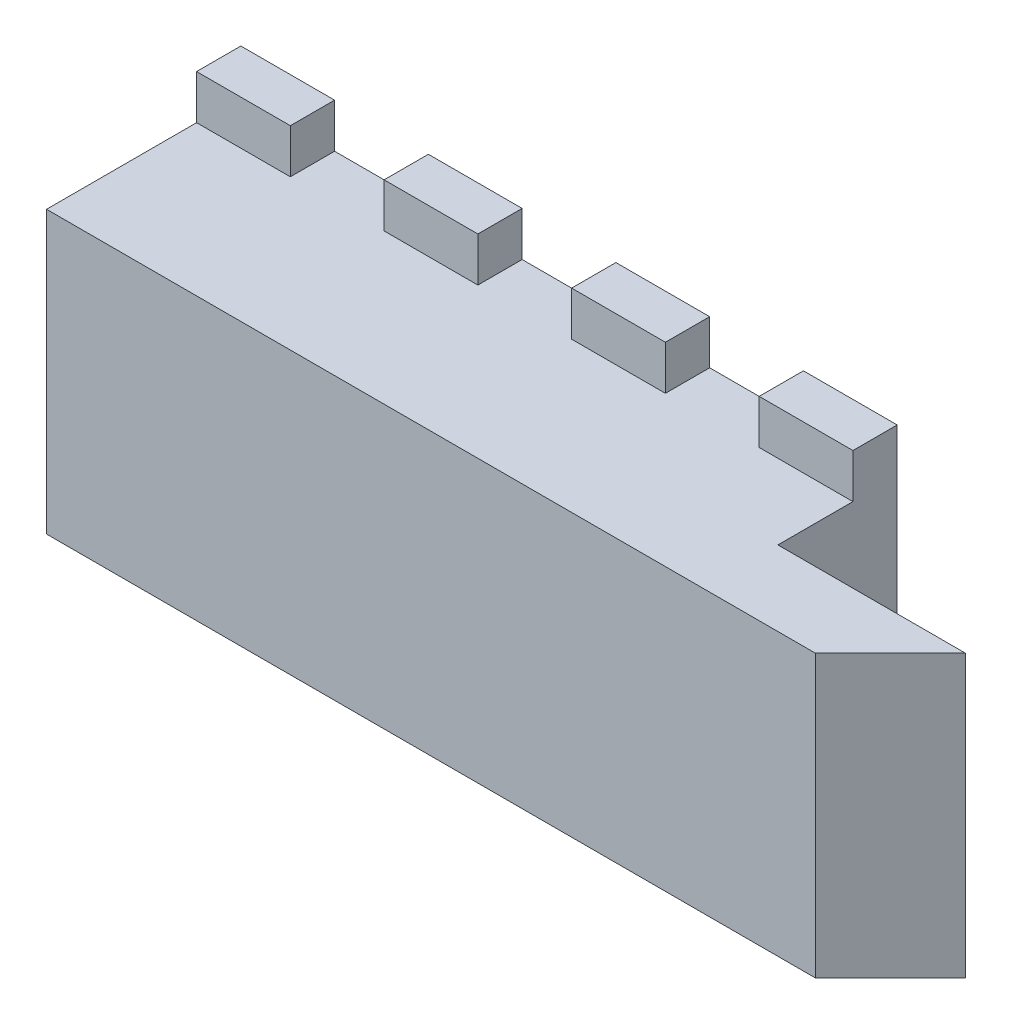
ISO-10303-21;
HEADER;
FILE_DESCRIPTION(('STEP AP214'),'2;1');
FILE_NAME('part.step','',(''),(''),'','','');
FILE_SCHEMA(('AUTOMOTIVE_DESIGN { 1 0 10303 214 1 1 1 1 }'));
ENDSEC;
DATA;
#1=APPLICATION_CONTEXT('core data for automotive mechanical design processes');
#2=APPLICATION_PROTOCOL_DEFINITION('international standard','automotive_design',2000,#1);
#3=PRODUCT_CONTEXT('',#1,'mechanical');
#4=PRODUCT('Part','Part','',(#3));
#5=PRODUCT_RELATED_PRODUCT_CATEGORY('part','',(#4));
#6=PRODUCT_DEFINITION_FORMATION('','',#4);
#7=PRODUCT_DEFINITION_CONTEXT('part definition',#1,'design');
#8=PRODUCT_DEFINITION('design','',#6,#7);
#9=PRODUCT_DEFINITION_SHAPE('','',#8);
#10=(LENGTH_UNIT() NAMED_UNIT(*) SI_UNIT(.MILLI.,.METRE.));
#11=(NAMED_UNIT(*) PLANE_ANGLE_UNIT() SI_UNIT($,.RADIAN.));
#12=(NAMED_UNIT(*) SI_UNIT($,.STERADIAN.) SOLID_ANGLE_UNIT());
#13=UNCERTAINTY_MEASURE_WITH_UNIT(LENGTH_MEASURE(1.E-05),#10,'distance_accuracy_value','');
#14=(GEOMETRIC_REPRESENTATION_CONTEXT(3) GLOBAL_UNCERTAINTY_ASSIGNED_CONTEXT((#13)) GLOBAL_UNIT_ASSIGNED_CONTEXT((#10,
#11,#12)) REPRESENTATION_CONTEXT('',''));
#15=CARTESIAN_POINT('',(0.,0.,0.));
#16=DIRECTION('',(0.,0.,1.));
#17=DIRECTION('',(1.,0.,0.));
#18=AXIS2_PLACEMENT_3D('',#15,#16,#17);
#19=CARTESIAN_POINT('',(22.225,-9.525,2.9972));
#20=DIRECTION('',(-1.,0.,0.));
#21=DIRECTION('',(0.,0.,1.));
#22=AXIS2_PLACEMENT_3D('',#19,#20,#21);
#23=PLANE('',#22);
#24=DIRECTION('',(0.,1.,0.));
#25=VECTOR('',#24,1.);
#26=CARTESIAN_POINT('',(22.225,9.525,8.0772));
#27=LINE('',#26,#25);
#28=CARTESIAN_POINT('',(22.225,-9.525,8.0772));
#29=VERTEX_POINT('',#28);
#30=CARTESIAN_POINT('',(22.225,9.525,8.0772));
#31=VERTEX_POINT('',#30);
#32=EDGE_CURVE('E283',#29,#31,#27,.T.);
#33=ORIENTED_EDGE('',*,*,#32,.F.);
#34=DIRECTION('',(0.,0.,-1.));
#35=VECTOR('',#34,1.);
#36=CARTESIAN_POINT('',(22.225,-9.525,13.1572));
#37=LINE('',#36,#35);
#38=CARTESIAN_POINT('',(22.225,-9.525,2.9972));
#39=VERTEX_POINT('',#38);
#40=EDGE_CURVE('E297',#29,#39,#37,.T.);
#41=ORIENTED_EDGE('',*,*,#40,.T.);
#42=DIRECTION('',(0.,1.,0.));
#43=VECTOR('',#42,1.);
#44=CARTESIAN_POINT('',(22.225,-9.525,2.9972));
#45=LINE('',#44,#43);
#46=CARTESIAN_POINT('',(22.225,-12.5222,2.9972));
#47=VERTEX_POINT('',#46);
#48=EDGE_CURVE('E499',#47,#39,#45,.T.);
#49=ORIENTED_EDGE('',*,*,#48,.F.);
#50=DIRECTION('',(0.,0.,-1.));
#51=VECTOR('',#50,1.);
#52=CARTESIAN_POINT('',(22.225,-12.5222,0.));
#53=LINE('',#52,#51);
#54=CARTESIAN_POINT('',(22.225,-12.5222,0.));
#55=VERTEX_POINT('',#54);
#56=EDGE_CURVE('E397',#47,#55,#53,.T.);
#57=ORIENTED_EDGE('',*,*,#56,.T.);
#58=DIRECTION('',(0.,1.,0.));
#59=VECTOR('',#58,1.);
#60=CARTESIAN_POINT('',(22.225,-9.525,0.));
#61=LINE('',#60,#59);
#62=CARTESIAN_POINT('',(22.225,12.5222,0.));
#63=VERTEX_POINT('',#62);
#64=EDGE_CURVE('E498',#55,#63,#61,.T.);
#65=ORIENTED_EDGE('',*,*,#64,.T.);
#66=DIRECTION('',(0.,0.,-1.));
#67=VECTOR('',#66,1.);
#68=CARTESIAN_POINT('',(22.225,12.5222,0.));
#69=LINE('',#68,#67);
#70=CARTESIAN_POINT('',(22.225,12.5222,2.9972));
#71=VERTEX_POINT('',#70);
#72=EDGE_CURVE('E469',#71,#63,#69,.T.);
#73=ORIENTED_EDGE('',*,*,#72,.F.);
#74=CARTESIAN_POINT('',(22.225,9.52499999999999,2.9972));
#75=VERTEX_POINT('',#74);
#76=EDGE_CURVE('E503',#75,#71,#45,.T.);
#77=ORIENTED_EDGE('',*,*,#76,.F.);
#78=DIRECTION('',(0.,0.,-1.));
#79=VECTOR('',#78,1.);
#80=CARTESIAN_POINT('',(22.225,9.525,13.1572));
#81=LINE('',#80,#79);
#82=EDGE_CURVE('E313',#31,#75,#81,.T.);
#83=ORIENTED_EDGE('',*,*,#82,.F.);
#84=EDGE_LOOP('',(#33,#41,#49,#57,#65,#73,#77,#83));
#85=FACE_BOUND('',#84,.T.);
#86=ADVANCED_FACE('F49',(#85),#23,.F.);
#87=CARTESIAN_POINT('',(0.,0.,2.9972));
#88=DIRECTION('',(0.,0.,-1.));
#89=DIRECTION('',(-1.,0.,0.));
#90=AXIS2_PLACEMENT_3D('',#87,#88,#89);
#91=PLANE('',#90);
#92=DIRECTION('',(1.,0.,0.));
#93=VECTOR('',#92,1.);
#94=CARTESIAN_POINT('',(-22.225,-9.525,2.9972));
#95=LINE('',#94,#93);
#96=CARTESIAN_POINT('',(-22.225,-9.525,2.9972));
#97=VERTEX_POINT('',#96);
#98=CARTESIAN_POINT('',(-15.875,-9.525,2.9972));
#99=VERTEX_POINT('',#98);
#100=EDGE_CURVE('E293',#97,#99,#95,.T.);
#101=ORIENTED_EDGE('',*,*,#100,.F.);
#102=DIRECTION('',(0.,-1.,0.));
#103=VECTOR('',#102,1.);
#104=CARTESIAN_POINT('',(-22.225,-9.525,2.9972));
#105=LINE('',#104,#103);
#106=CARTESIAN_POINT('',(-22.225,-12.5222,2.9972));
#107=VERTEX_POINT('',#106);
#108=EDGE_CURVE('E502',#97,#107,#105,.T.);
#109=ORIENTED_EDGE('',*,*,#108,.T.);
#110=DIRECTION('',(1.,0.,0.));
#111=VECTOR('',#110,1.);
#112=CARTESIAN_POINT('',(-22.225,-12.5222,2.9972));
#113=LINE('',#112,#111);
#114=CARTESIAN_POINT('',(-15.875,-12.5222,2.9972));
#115=VERTEX_POINT('',#114);
#116=EDGE_CURVE('E326',#107,#115,#113,.T.);
#117=ORIENTED_EDGE('',*,*,#116,.T.);
#118=DIRECTION('',(0.,1.,0.));
#119=VECTOR('',#118,1.);
#120=CARTESIAN_POINT('',(-15.875,-12.5222,2.9972));
#121=LINE('',#120,#119);
#122=EDGE_CURVE('E329',#115,#99,#121,.T.);
#123=ORIENTED_EDGE('',*,*,#122,.T.);
#124=EDGE_LOOP('',(#101,#109,#117,#123));
#125=FACE_BOUND('',#124,.T.);
#126=ADVANCED_FACE('F547',(#125),#91,.F.);
#127=CARTESIAN_POINT('',(-9.525,-9.525,2.9972));
#128=VERTEX_POINT('',#127);
#129=CARTESIAN_POINT('',(-3.175,-9.525,2.9972));
#130=VERTEX_POINT('',#129);
#131=EDGE_CURVE('E304',#128,#130,#95,.T.);
#132=ORIENTED_EDGE('',*,*,#131,.F.);
#133=DIRECTION('',(0.,1.,0.));
#134=VECTOR('',#133,1.);
#135=CARTESIAN_POINT('',(-9.525,-12.5222,2.9972));
#136=LINE('',#135,#134);
#137=CARTESIAN_POINT('',(-9.525,-12.5222,2.9972));
#138=VERTEX_POINT('',#137);
#139=EDGE_CURVE('E350',#138,#128,#136,.T.);
#140=ORIENTED_EDGE('',*,*,#139,.F.);
#141=DIRECTION('',(1.,0.,0.));
#142=VECTOR('',#141,1.);
#143=CARTESIAN_POINT('',(-9.525,-12.5222,2.9972));
#144=LINE('',#143,#142);
#145=CARTESIAN_POINT('',(-3.175,-12.5222,2.9972));
#146=VERTEX_POINT('',#145);
#147=EDGE_CURVE('E347',#138,#146,#144,.T.);
#148=ORIENTED_EDGE('',*,*,#147,.T.);
#149=DIRECTION('',(0.,1.,0.));
#150=VECTOR('',#149,1.);
#151=CARTESIAN_POINT('',(-3.175,-12.5222,2.9972));
#152=LINE('',#151,#150);
#153=EDGE_CURVE('E359',#146,#130,#152,.T.);
#154=ORIENTED_EDGE('',*,*,#153,.T.);
#155=EDGE_LOOP('',(#132,#140,#148,#154));
#156=FACE_BOUND('',#155,.T.);
#157=ADVANCED_FACE('F605',(#156),#91,.F.);
#158=CARTESIAN_POINT('',(3.175,-9.525,2.9972));
#159=VERTEX_POINT('',#158);
#160=CARTESIAN_POINT('',(9.525,-9.525,2.9972));
#161=VERTEX_POINT('',#160);
#162=EDGE_CURVE('E519',#159,#161,#95,.T.);
#163=ORIENTED_EDGE('',*,*,#162,.F.);
#164=DIRECTION('',(0.,1.,0.));
#165=VECTOR('',#164,1.);
#166=CARTESIAN_POINT('',(3.175,-12.5222,2.9972));
#167=LINE('',#166,#165);
#168=CARTESIAN_POINT('',(3.175,-12.5222,2.9972));
#169=VERTEX_POINT('',#168);
#170=EDGE_CURVE('E377',#169,#159,#167,.T.);
#171=ORIENTED_EDGE('',*,*,#170,.F.);
#172=DIRECTION('',(1.,0.,0.));
#173=VECTOR('',#172,1.);
#174=CARTESIAN_POINT('',(3.175,-12.5222,2.9972));
#175=LINE('',#174,#173);
#176=CARTESIAN_POINT('',(9.525,-12.5222,2.9972));
#177=VERTEX_POINT('',#176);
#178=EDGE_CURVE('E374',#169,#177,#175,.T.);
#179=ORIENTED_EDGE('',*,*,#178,.T.);
#180=DIRECTION('',(0.,1.,0.));
#181=VECTOR('',#180,1.);
#182=CARTESIAN_POINT('',(9.525,-12.5222,2.9972));
#183=LINE('',#182,#181);
#184=EDGE_CURVE('E386',#177,#161,#183,.T.);
#185=ORIENTED_EDGE('',*,*,#184,.T.);
#186=EDGE_LOOP('',(#163,#171,#179,#185));
#187=FACE_BOUND('',#186,.T.);
#188=ADVANCED_FACE('F570',(#187),#91,.F.);
#189=CARTESIAN_POINT('',(15.875,-9.525,2.9972));
#190=VERTEX_POINT('',#189);
#191=EDGE_CURVE('E305',#190,#39,#95,.T.);
#192=ORIENTED_EDGE('',*,*,#191,.F.);
#193=DIRECTION('',(0.,1.,0.));
#194=VECTOR('',#193,1.);
#195=CARTESIAN_POINT('',(15.875,-12.5222,2.9972));
#196=LINE('',#195,#194);
#197=CARTESIAN_POINT('',(15.875,-12.5222,2.9972));
#198=VERTEX_POINT('',#197);
#199=EDGE_CURVE('E403',#198,#190,#196,.T.);
#200=ORIENTED_EDGE('',*,*,#199,.F.);
#201=DIRECTION('',(1.,0.,0.));
#202=VECTOR('',#201,1.);
#203=CARTESIAN_POINT('',(15.875,-12.5222,2.9972));
#204=LINE('',#203,#202);
#205=EDGE_CURVE('E400',#198,#47,#204,.T.);
#206=ORIENTED_EDGE('',*,*,#205,.T.);
#207=ORIENTED_EDGE('',*,*,#48,.T.);
#208=EDGE_LOOP('',(#192,#200,#206,#207));
#209=FACE_BOUND('',#208,.T.);
#210=ADVANCED_FACE('F583',(#209),#91,.F.);
#211=DIRECTION('',(-1.,0.,0.));
#212=VECTOR('',#211,1.);
#213=CARTESIAN_POINT('',(-22.225,9.525,2.9972));
#214=LINE('',#213,#212);
#215=CARTESIAN_POINT('',(15.875,9.525,2.9972));
#216=VERTEX_POINT('',#215);
#217=EDGE_CURVE('E284',#75,#216,#214,.T.);
#218=ORIENTED_EDGE('',*,*,#217,.F.);
#219=ORIENTED_EDGE('',*,*,#76,.T.);
#220=DIRECTION('',(1.,0.,0.));
#221=VECTOR('',#220,1.);
#222=CARTESIAN_POINT('',(15.875,12.5222,2.9972));
#223=LINE('',#222,#221);
#224=CARTESIAN_POINT('',(15.875,12.5222,2.9972));
#225=VERTEX_POINT('',#224);
#226=EDGE_CURVE('E466',#225,#71,#223,.T.);
#227=ORIENTED_EDGE('',*,*,#226,.F.);
#228=DIRECTION('',(0.,-1.,0.));
#229=VECTOR('',#228,1.);
#230=CARTESIAN_POINT('',(15.875,12.5222,2.9972));
#231=LINE('',#230,#229);
#232=EDGE_CURVE('E451',#225,#216,#231,.T.);
#233=ORIENTED_EDGE('',*,*,#232,.T.);
#234=EDGE_LOOP('',(#218,#219,#227,#233));
#235=FACE_BOUND('',#234,.T.);
#236=ADVANCED_FACE('F676',(#235),#91,.F.);
#237=CARTESIAN_POINT('',(9.525,9.525,2.9972));
#238=VERTEX_POINT('',#237);
#239=CARTESIAN_POINT('',(3.175,9.525,2.9972));
#240=VERTEX_POINT('',#239);
#241=EDGE_CURVE('E300',#238,#240,#214,.T.);
#242=ORIENTED_EDGE('',*,*,#241,.F.);
#243=DIRECTION('',(0.,-1.,0.));
#244=VECTOR('',#243,1.);
#245=CARTESIAN_POINT('',(9.525,12.5222,2.9972));
#246=LINE('',#245,#244);
#247=CARTESIAN_POINT('',(9.525,12.5222,2.9972));
#248=VERTEX_POINT('',#247);
#249=EDGE_CURVE('E459',#248,#238,#246,.T.);
#250=ORIENTED_EDGE('',*,*,#249,.F.);
#251=DIRECTION('',(1.,0.,0.));
#252=VECTOR('',#251,1.);
#253=CARTESIAN_POINT('',(3.175,12.5222,2.9972));
#254=LINE('',#253,#252);
#255=CARTESIAN_POINT('',(3.175,12.5222,2.9972));
#256=VERTEX_POINT('',#255);
#257=EDGE_CURVE('E440',#256,#248,#254,.T.);
#258=ORIENTED_EDGE('',*,*,#257,.F.);
#259=DIRECTION('',(0.,-1.,0.));
#260=VECTOR('',#259,1.);
#261=CARTESIAN_POINT('',(3.175,12.5222,2.9972));
#262=LINE('',#261,#260);
#263=EDGE_CURVE('E423',#256,#240,#262,.T.);
#264=ORIENTED_EDGE('',*,*,#263,.T.);
#265=EDGE_LOOP('',(#242,#250,#258,#264));
#266=FACE_BOUND('',#265,.T.);
#267=ADVANCED_FACE('F671',(#266),#91,.F.);
#268=CARTESIAN_POINT('',(-3.175,9.525,2.9972));
#269=VERTEX_POINT('',#268);
#270=CARTESIAN_POINT('',(-9.525,9.525,2.9972));
#271=VERTEX_POINT('',#270);
#272=EDGE_CURVE('E524',#269,#271,#214,.T.);
#273=ORIENTED_EDGE('',*,*,#272,.F.);
#274=DIRECTION('',(0.,-1.,0.));
#275=VECTOR('',#274,1.);
#276=CARTESIAN_POINT('',(-3.175,12.5222,2.9972));
#277=LINE('',#276,#275);
#278=CARTESIAN_POINT('',(-3.175,12.5222,2.9972));
#279=VERTEX_POINT('',#278);
#280=EDGE_CURVE('E431',#279,#269,#277,.T.);
#281=ORIENTED_EDGE('',*,*,#280,.F.);
#282=DIRECTION('',(1.,0.,0.));
#283=VECTOR('',#282,1.);
#284=CARTESIAN_POINT('',(-9.525,12.5222,2.9972));
#285=LINE('',#284,#283);
#286=CARTESIAN_POINT('',(-9.525,12.5222,2.9972));
#287=VERTEX_POINT('',#286);
#288=EDGE_CURVE('E412',#287,#279,#285,.T.);
#289=ORIENTED_EDGE('',*,*,#288,.F.);
#290=DIRECTION('',(0.,-1.,0.));
#291=VECTOR('',#290,1.);
#292=CARTESIAN_POINT('',(-9.525,12.5222,2.9972));
#293=LINE('',#292,#291);
#294=EDGE_CURVE('E434',#287,#271,#293,.T.);
#295=ORIENTED_EDGE('',*,*,#294,.T.);
#296=EDGE_LOOP('',(#273,#281,#289,#295));
#297=FACE_BOUND('',#296,.T.);
#298=ADVANCED_FACE('F661',(#297),#91,.F.);
#299=CARTESIAN_POINT('',(-15.875,9.525,2.9972));
#300=VERTEX_POINT('',#299);
#301=CARTESIAN_POINT('',(-22.225,9.525,2.9972));
#302=VERTEX_POINT('',#301);
#303=EDGE_CURVE('E301',#300,#302,#214,.T.);
#304=ORIENTED_EDGE('',*,*,#303,.F.);
#305=DIRECTION('',(0.,-1.,0.));
#306=VECTOR('',#305,1.);
#307=CARTESIAN_POINT('',(-15.875,12.5222,2.9972));
#308=LINE('',#307,#306);
#309=CARTESIAN_POINT('',(-15.875,12.5222,2.9972));
#310=VERTEX_POINT('',#309);
#311=EDGE_CURVE('E495',#310,#300,#308,.T.);
#312=ORIENTED_EDGE('',*,*,#311,.F.);
#313=DIRECTION('',(1.,0.,0.));
#314=VECTOR('',#313,1.);
#315=CARTESIAN_POINT('',(-22.225,12.5222,2.9972));
#316=LINE('',#315,#314);
#317=CARTESIAN_POINT('',(-22.225,12.5222,2.9972));
#318=VERTEX_POINT('',#317);
#319=EDGE_CURVE('E483',#318,#310,#316,.T.);
#320=ORIENTED_EDGE('',*,*,#319,.F.);
#321=EDGE_CURVE('E504',#318,#302,#105,.T.);
#322=ORIENTED_EDGE('',*,*,#321,.T.);
#323=EDGE_LOOP('',(#304,#312,#320,#322));
#324=FACE_BOUND('',#323,.T.);
#325=ADVANCED_FACE('F607',(#324),#91,.F.);
#326=CARTESIAN_POINT('',(-22.225,9.525,2.9972));
#327=DIRECTION('',(0.,-1.,0.));
#328=DIRECTION('',(0.,0.,-1.));
#329=AXIS2_PLACEMENT_3D('',#326,#327,#328);
#330=PLANE('',#329);
#331=DIRECTION('',(-1.,0.,0.));
#332=VECTOR('',#331,1.);
#333=CARTESIAN_POINT('',(-22.225,9.525,13.1572));
#334=LINE('',#333,#332);
#335=CARTESIAN_POINT('',(29.845,9.525,13.1572));
#336=VERTEX_POINT('',#335);
#337=CARTESIAN_POINT('',(-22.225,9.525,13.1572));
#338=VERTEX_POINT('',#337);
#339=EDGE_CURVE('E275',#336,#338,#334,.T.);
#340=ORIENTED_EDGE('',*,*,#339,.F.);
#341=DIRECTION('',(-0.707106781186548,0.,0.707106781186547));
#342=VECTOR('',#341,1.);
#343=CARTESIAN_POINT('',(34.925,9.525,8.07719999999999));
#344=LINE('',#343,#342);
#345=CARTESIAN_POINT('',(34.925,9.525,8.0772));
#346=VERTEX_POINT('',#345);
#347=EDGE_CURVE('E11',#336,#346,#344,.F.);
#348=ORIENTED_EDGE('',*,*,#347,.T.);
#349=DIRECTION('',(-1.,0.,0.));
#350=VECTOR('',#349,1.);
#351=CARTESIAN_POINT('',(34.925,9.525,8.0772));
#352=LINE('',#351,#350);
#353=EDGE_CURVE('E272',#346,#31,#352,.T.);
#354=ORIENTED_EDGE('',*,*,#353,.T.);
#355=ORIENTED_EDGE('',*,*,#82,.T.);
#356=ORIENTED_EDGE('',*,*,#217,.T.);
#357=DIRECTION('',(0.,0.,1.));
#358=VECTOR('',#357,1.);
#359=CARTESIAN_POINT('',(15.875,9.525,0.));
#360=LINE('',#359,#358);
#361=CARTESIAN_POINT('',(15.875,9.525,0.));
#362=VERTEX_POINT('',#361);
#363=EDGE_CURVE('E336',#362,#216,#360,.T.);
#364=ORIENTED_EDGE('',*,*,#363,.F.);
#365=DIRECTION('',(-1.,0.,0.));
#366=VECTOR('',#365,1.);
#367=CARTESIAN_POINT('',(-22.225,9.525,0.));
#368=LINE('',#367,#366);
#369=CARTESIAN_POINT('',(9.525,9.525,0.));
#370=VERTEX_POINT('',#369);
#371=EDGE_CURVE('E510',#362,#370,#368,.T.);
#372=ORIENTED_EDGE('',*,*,#371,.T.);
#373=DIRECTION('',(0.,0.,-1.));
#374=VECTOR('',#373,1.);
#375=CARTESIAN_POINT('',(9.525,9.525,0.));
#376=LINE('',#375,#374);
#377=EDGE_CURVE('E441',#238,#370,#376,.T.);
#378=ORIENTED_EDGE('',*,*,#377,.F.);
#379=ORIENTED_EDGE('',*,*,#241,.T.);
#380=DIRECTION('',(0.,0.,1.));
#381=VECTOR('',#380,1.);
#382=CARTESIAN_POINT('',(3.175,9.525,0.));
#383=LINE('',#382,#381);
#384=CARTESIAN_POINT('',(3.175,9.525,0.));
#385=VERTEX_POINT('',#384);
#386=EDGE_CURVE('E448',#385,#240,#383,.T.);
#387=ORIENTED_EDGE('',*,*,#386,.F.);
#388=CARTESIAN_POINT('',(-3.175,9.525,0.));
#389=VERTEX_POINT('',#388);
#390=EDGE_CURVE('E509',#385,#389,#368,.T.);
#391=ORIENTED_EDGE('',*,*,#390,.T.);
#392=DIRECTION('',(0.,0.,-1.));
#393=VECTOR('',#392,1.);
#394=CARTESIAN_POINT('',(-3.175,9.525,0.));
#395=LINE('',#394,#393);
#396=EDGE_CURVE('E413',#269,#389,#395,.T.);
#397=ORIENTED_EDGE('',*,*,#396,.F.);
#398=ORIENTED_EDGE('',*,*,#272,.T.);
#399=DIRECTION('',(0.,0.,1.));
#400=VECTOR('',#399,1.);
#401=CARTESIAN_POINT('',(-9.525,9.525,0.));
#402=LINE('',#401,#400);
#403=CARTESIAN_POINT('',(-9.525,9.525,0.));
#404=VERTEX_POINT('',#403);
#405=EDGE_CURVE('E420',#404,#271,#402,.T.);
#406=ORIENTED_EDGE('',*,*,#405,.F.);
#407=CARTESIAN_POINT('',(-15.875,9.525,0.));
#408=VERTEX_POINT('',#407);
#409=EDGE_CURVE('E507',#404,#408,#368,.T.);
#410=ORIENTED_EDGE('',*,*,#409,.T.);
#411=DIRECTION('',(0.,0.,-1.));
#412=VECTOR('',#411,1.);
#413=CARTESIAN_POINT('',(-15.875,9.525,0.));
#414=LINE('',#413,#412);
#415=EDGE_CURVE('E436',#300,#408,#414,.T.);
#416=ORIENTED_EDGE('',*,*,#415,.F.);
#417=ORIENTED_EDGE('',*,*,#303,.T.);
#418=DIRECTION('',(0.,0.,-1.));
#419=VECTOR('',#418,1.);
#420=CARTESIAN_POINT('',(-22.225,9.525,13.1572));
#421=LINE('',#420,#419);
#422=EDGE_CURVE('E310',#338,#302,#421,.T.);
#423=ORIENTED_EDGE('',*,*,#422,.F.);
#424=EDGE_LOOP('',(#340,#348,#354,#355,#356,#364,#372,#378,#379,#387,#391,#397,#398,#406,#410,
#416,#417,#423));
#425=FACE_BOUND('',#424,.T.);
#426=ADVANCED_FACE('F271',(#425),#330,.F.);
#427=CARTESIAN_POINT('',(-22.225,-9.525,2.9972));
#428=DIRECTION('',(1.,0.,0.));
#429=DIRECTION('',(0.,0.,-1.));
#430=AXIS2_PLACEMENT_3D('',#427,#428,#429);
#431=PLANE('',#430);
#432=DIRECTION('',(0.,-1.,0.));
#433=VECTOR('',#432,1.);
#434=CARTESIAN_POINT('',(-22.225,-9.525,0.));
#435=LINE('',#434,#433);
#436=CARTESIAN_POINT('',(-22.225,12.5222,0.));
#437=VERTEX_POINT('',#436);
#438=CARTESIAN_POINT('',(-22.225,-12.5222,0.));
#439=VERTEX_POINT('',#438);
#440=EDGE_CURVE('E511',#437,#439,#435,.T.);
#441=ORIENTED_EDGE('',*,*,#440,.T.);
#442=DIRECTION('',(0.,0.,1.));
#443=VECTOR('',#442,1.);
#444=CARTESIAN_POINT('',(-22.225,-12.5222,0.));
#445=LINE('',#444,#443);
#446=EDGE_CURVE('E316',#439,#107,#445,.T.);
#447=ORIENTED_EDGE('',*,*,#446,.T.);
#448=ORIENTED_EDGE('',*,*,#108,.F.);
#449=DIRECTION('',(0.,0.,-1.));
#450=VECTOR('',#449,1.);
#451=CARTESIAN_POINT('',(-22.225,-9.525,13.1572));
#452=LINE('',#451,#450);
#453=CARTESIAN_POINT('',(-22.225,-9.525,13.1572));
#454=VERTEX_POINT('',#453);
#455=EDGE_CURVE('E307',#454,#97,#452,.T.);
#456=ORIENTED_EDGE('',*,*,#455,.F.);
#457=DIRECTION('',(0.,-1.,0.));
#458=VECTOR('',#457,1.);
#459=CARTESIAN_POINT('',(-22.225,9.525,13.1572));
#460=LINE('',#459,#458);
#461=EDGE_CURVE('E292',#338,#454,#460,.T.);
#462=ORIENTED_EDGE('',*,*,#461,.F.);
#463=ORIENTED_EDGE('',*,*,#422,.T.);
#464=ORIENTED_EDGE('',*,*,#321,.F.);
#465=DIRECTION('',(0.,0.,1.));
#466=VECTOR('',#465,1.);
#467=CARTESIAN_POINT('',(-22.225,12.5222,0.));
#468=LINE('',#467,#466);
#469=EDGE_CURVE('E480',#437,#318,#468,.T.);
#470=ORIENTED_EDGE('',*,*,#469,.F.);
#471=EDGE_LOOP('',(#441,#447,#448,#456,#462,#463,#464,#470));
#472=FACE_BOUND('',#471,.T.);
#473=ADVANCED_FACE('F536',(#472),#431,.F.);
#474=CARTESIAN_POINT('',(-22.225,-9.525,2.9972));
#475=DIRECTION('',(0.,1.,0.));
#476=DIRECTION('',(0.,0.,1.));
#477=AXIS2_PLACEMENT_3D('',#474,#475,#476);
#478=PLANE('',#477);
#479=DIRECTION('',(-1.,0.,0.));
#480=VECTOR('',#479,1.);
#481=CARTESIAN_POINT('',(34.925,-9.525,8.0772));
#482=LINE('',#481,#480);
#483=CARTESIAN_POINT('',(34.925,-9.525,8.0772));
#484=VERTEX_POINT('',#483);
#485=EDGE_CURVE('E285',#484,#29,#482,.T.);
#486=ORIENTED_EDGE('',*,*,#485,.F.);
#487=DIRECTION('',(0.707106781186548,0.,-0.707106781186547));
#488=VECTOR('',#487,1.);
#489=CARTESIAN_POINT('',(34.925,-9.525,8.07719999999999));
#490=LINE('',#489,#488);
#491=CARTESIAN_POINT('',(29.845,-9.525,13.1572));
#492=VERTEX_POINT('',#491);
#493=EDGE_CURVE('E72',#484,#492,#490,.F.);
#494=ORIENTED_EDGE('',*,*,#493,.T.);
#495=DIRECTION('',(1.,0.,0.));
#496=VECTOR('',#495,1.);
#497=CARTESIAN_POINT('',(-22.225,-9.525,13.1572));
#498=LINE('',#497,#496);
#499=EDGE_CURVE('E295',#454,#492,#498,.T.);
#500=ORIENTED_EDGE('',*,*,#499,.F.);
#501=ORIENTED_EDGE('',*,*,#455,.T.);
#502=ORIENTED_EDGE('',*,*,#100,.T.);
#503=DIRECTION('',(0.,0.,-1.));
#504=VECTOR('',#503,1.);
#505=CARTESIAN_POINT('',(-15.875,-9.525,0.));
#506=LINE('',#505,#504);
#507=CARTESIAN_POINT('',(-15.875,-9.525,0.));
#508=VERTEX_POINT('',#507);
#509=EDGE_CURVE('E320',#99,#508,#506,.T.);
#510=ORIENTED_EDGE('',*,*,#509,.T.);
#511=DIRECTION('',(1.,0.,0.));
#512=VECTOR('',#511,1.);
#513=CARTESIAN_POINT('',(-22.225,-9.525,0.));
#514=LINE('',#513,#512);
#515=CARTESIAN_POINT('',(-9.525,-9.525,0.));
#516=VERTEX_POINT('',#515);
#517=EDGE_CURVE('E517',#508,#516,#514,.T.);
#518=ORIENTED_EDGE('',*,*,#517,.T.);
#519=DIRECTION('',(0.,0.,1.));
#520=VECTOR('',#519,1.);
#521=CARTESIAN_POINT('',(-9.525,-9.525,0.));
#522=LINE('',#521,#520);
#523=EDGE_CURVE('E351',#516,#128,#522,.T.);
#524=ORIENTED_EDGE('',*,*,#523,.T.);
#525=ORIENTED_EDGE('',*,*,#131,.T.);
#526=DIRECTION('',(0.,0.,-1.));
#527=VECTOR('',#526,1.);
#528=CARTESIAN_POINT('',(-3.175,-9.525,0.));
#529=LINE('',#528,#527);
#530=CARTESIAN_POINT('',(-3.175,-9.525,0.));
#531=VERTEX_POINT('',#530);
#532=EDGE_CURVE('E341',#130,#531,#529,.T.);
#533=ORIENTED_EDGE('',*,*,#532,.T.);
#534=CARTESIAN_POINT('',(3.175,-9.525,0.));
#535=VERTEX_POINT('',#534);
#536=EDGE_CURVE('E516',#531,#535,#514,.T.);
#537=ORIENTED_EDGE('',*,*,#536,.T.);
#538=DIRECTION('',(0.,0.,1.));
#539=VECTOR('',#538,1.);
#540=CARTESIAN_POINT('',(3.175,-9.525,0.));
#541=LINE('',#540,#539);
#542=EDGE_CURVE('E378',#535,#159,#541,.T.);
#543=ORIENTED_EDGE('',*,*,#542,.T.);
#544=ORIENTED_EDGE('',*,*,#162,.T.);
#545=DIRECTION('',(0.,0.,-1.));
#546=VECTOR('',#545,1.);
#547=CARTESIAN_POINT('',(9.525,-9.525,0.));
#548=LINE('',#547,#546);
#549=CARTESIAN_POINT('',(9.525,-9.525,0.));
#550=VERTEX_POINT('',#549);
#551=EDGE_CURVE('E368',#161,#550,#548,.T.);
#552=ORIENTED_EDGE('',*,*,#551,.T.);
#553=CARTESIAN_POINT('',(15.875,-9.525,0.));
#554=VERTEX_POINT('',#553);
#555=EDGE_CURVE('E513',#550,#554,#514,.T.);
#556=ORIENTED_EDGE('',*,*,#555,.T.);
#557=DIRECTION('',(0.,0.,1.));
#558=VECTOR('',#557,1.);
#559=CARTESIAN_POINT('',(15.875,-9.525,0.));
#560=LINE('',#559,#558);
#561=EDGE_CURVE('E315',#554,#190,#560,.T.);
#562=ORIENTED_EDGE('',*,*,#561,.T.);
#563=ORIENTED_EDGE('',*,*,#191,.T.);
#564=ORIENTED_EDGE('',*,*,#40,.F.);
#565=EDGE_LOOP('',(#486,#494,#500,#501,#502,#510,#518,#524,#525,#533,#537,#543,#544,#552,#556,
#562,#563,#564));
#566=FACE_BOUND('',#565,.T.);
#567=ADVANCED_FACE('F542',(#566),#478,.F.);
#568=CARTESIAN_POINT('',(0.,0.,0.));
#569=DIRECTION('',(0.,0.,-1.));
#570=DIRECTION('',(-1.,0.,0.));
#571=AXIS2_PLACEMENT_3D('',#568,#569,#570);
#572=PLANE('',#571);
#573=ORIENTED_EDGE('',*,*,#64,.F.);
#574=DIRECTION('',(-1.,0.,0.));
#575=VECTOR('',#574,1.);
#576=CARTESIAN_POINT('',(15.875,-12.5222,0.));
#577=LINE('',#576,#575);
#578=CARTESIAN_POINT('',(15.875,-12.5222,0.));
#579=VERTEX_POINT('',#578);
#580=EDGE_CURVE('E394',#55,#579,#577,.T.);
#581=ORIENTED_EDGE('',*,*,#580,.T.);
#582=DIRECTION('',(0.,1.,0.));
#583=VECTOR('',#582,1.);
#584=CARTESIAN_POINT('',(15.875,-12.5222,0.));
#585=LINE('',#584,#583);
#586=EDGE_CURVE('E381',#579,#554,#585,.T.);
#587=ORIENTED_EDGE('',*,*,#586,.T.);
#588=ORIENTED_EDGE('',*,*,#555,.F.);
#589=DIRECTION('',(0.,1.,0.));
#590=VECTOR('',#589,1.);
#591=CARTESIAN_POINT('',(9.525,-12.5222,0.));
#592=LINE('',#591,#590);
#593=CARTESIAN_POINT('',(9.525,-12.5222,0.));
#594=VERTEX_POINT('',#593);
#595=EDGE_CURVE('E388',#594,#550,#592,.T.);
#596=ORIENTED_EDGE('',*,*,#595,.F.);
#597=DIRECTION('',(-1.,0.,0.));
#598=VECTOR('',#597,1.);
#599=CARTESIAN_POINT('',(3.175,-12.5222,0.));
#600=LINE('',#599,#598);
#601=CARTESIAN_POINT('',(3.175,-12.5222,0.));
#602=VERTEX_POINT('',#601);
#603=EDGE_CURVE('E367',#594,#602,#600,.T.);
#604=ORIENTED_EDGE('',*,*,#603,.T.);
#605=DIRECTION('',(0.,1.,0.));
#606=VECTOR('',#605,1.);
#607=CARTESIAN_POINT('',(3.175,-12.5222,0.));
#608=LINE('',#607,#606);
#609=EDGE_CURVE('E354',#602,#535,#608,.T.);
#610=ORIENTED_EDGE('',*,*,#609,.T.);
#611=ORIENTED_EDGE('',*,*,#536,.F.);
#612=DIRECTION('',(0.,1.,0.));
#613=VECTOR('',#612,1.);
#614=CARTESIAN_POINT('',(-3.175,-12.5222,0.));
#615=LINE('',#614,#613);
#616=CARTESIAN_POINT('',(-3.175,-12.5222,0.));
#617=VERTEX_POINT('',#616);
#618=EDGE_CURVE('E361',#617,#531,#615,.T.);
#619=ORIENTED_EDGE('',*,*,#618,.F.);
#620=DIRECTION('',(-1.,0.,0.));
#621=VECTOR('',#620,1.);
#622=CARTESIAN_POINT('',(-9.525,-12.5222,0.));
#623=LINE('',#622,#621);
#624=CARTESIAN_POINT('',(-9.525,-12.5222,0.));
#625=VERTEX_POINT('',#624);
#626=EDGE_CURVE('E340',#617,#625,#623,.T.);
#627=ORIENTED_EDGE('',*,*,#626,.T.);
#628=DIRECTION('',(0.,1.,0.));
#629=VECTOR('',#628,1.);
#630=CARTESIAN_POINT('',(-9.525,-12.5222,0.));
#631=LINE('',#630,#629);
#632=EDGE_CURVE('E332',#625,#516,#631,.T.);
#633=ORIENTED_EDGE('',*,*,#632,.T.);
#634=ORIENTED_EDGE('',*,*,#517,.F.);
#635=DIRECTION('',(0.,1.,0.));
#636=VECTOR('',#635,1.);
#637=CARTESIAN_POINT('',(-15.875,-12.5222,0.));
#638=LINE('',#637,#636);
#639=CARTESIAN_POINT('',(-15.875,-12.5222,0.));
#640=VERTEX_POINT('',#639);
#641=EDGE_CURVE('E334',#640,#508,#638,.T.);
#642=ORIENTED_EDGE('',*,*,#641,.F.);
#643=DIRECTION('',(-1.,0.,0.));
#644=VECTOR('',#643,1.);
#645=CARTESIAN_POINT('',(-22.225,-12.5222,0.));
#646=LINE('',#645,#644);
#647=EDGE_CURVE('E319',#640,#439,#646,.T.);
#648=ORIENTED_EDGE('',*,*,#647,.T.);
#649=ORIENTED_EDGE('',*,*,#440,.F.);
#650=DIRECTION('',(-1.,0.,0.));
#651=VECTOR('',#650,1.);
#652=CARTESIAN_POINT('',(-22.225,12.5222,0.));
#653=LINE('',#652,#651);
#654=CARTESIAN_POINT('',(-15.875,12.5222,0.));
#655=VERTEX_POINT('',#654);
#656=EDGE_CURVE('E487',#655,#437,#653,.T.);
#657=ORIENTED_EDGE('',*,*,#656,.F.);
#658=DIRECTION('',(0.,-1.,0.));
#659=VECTOR('',#658,1.);
#660=CARTESIAN_POINT('',(-15.875,12.5222,0.));
#661=LINE('',#660,#659);
#662=EDGE_CURVE('E490',#655,#408,#661,.T.);
#663=ORIENTED_EDGE('',*,*,#662,.T.);
#664=ORIENTED_EDGE('',*,*,#409,.F.);
#665=DIRECTION('',(0.,-1.,0.));
#666=VECTOR('',#665,1.);
#667=CARTESIAN_POINT('',(-9.525,12.5222,0.));
#668=LINE('',#667,#666);
#669=CARTESIAN_POINT('',(-9.525,12.5222,0.));
#670=VERTEX_POINT('',#669);
#671=EDGE_CURVE('E419',#670,#404,#668,.T.);
#672=ORIENTED_EDGE('',*,*,#671,.F.);
#673=DIRECTION('',(-1.,0.,0.));
#674=VECTOR('',#673,1.);
#675=CARTESIAN_POINT('',(-9.525,12.5222,0.));
#676=LINE('',#675,#674);
#677=CARTESIAN_POINT('',(-3.175,12.5222,0.));
#678=VERTEX_POINT('',#677);
#679=EDGE_CURVE('E417',#678,#670,#676,.T.);
#680=ORIENTED_EDGE('',*,*,#679,.F.);
#681=DIRECTION('',(0.,-1.,0.));
#682=VECTOR('',#681,1.);
#683=CARTESIAN_POINT('',(-3.175,12.5222,0.));
#684=LINE('',#683,#682);
#685=EDGE_CURVE('E428',#678,#389,#684,.T.);
#686=ORIENTED_EDGE('',*,*,#685,.T.);
#687=ORIENTED_EDGE('',*,*,#390,.F.);
#688=DIRECTION('',(0.,-1.,0.));
#689=VECTOR('',#688,1.);
#690=CARTESIAN_POINT('',(3.175,12.5222,0.));
#691=LINE('',#690,#689);
#692=CARTESIAN_POINT('',(3.175,12.5222,0.));
#693=VERTEX_POINT('',#692);
#694=EDGE_CURVE('E447',#693,#385,#691,.T.);
#695=ORIENTED_EDGE('',*,*,#694,.F.);
#696=DIRECTION('',(-1.,0.,0.));
#697=VECTOR('',#696,1.);
#698=CARTESIAN_POINT('',(3.175,12.5222,0.));
#699=LINE('',#698,#697);
#700=CARTESIAN_POINT('',(9.525,12.5222,0.));
#701=VERTEX_POINT('',#700);
#702=EDGE_CURVE('E445',#701,#693,#699,.T.);
#703=ORIENTED_EDGE('',*,*,#702,.F.);
#704=DIRECTION('',(0.,-1.,0.));
#705=VECTOR('',#704,1.);
#706=CARTESIAN_POINT('',(9.525,12.5222,0.));
#707=LINE('',#706,#705);
#708=EDGE_CURVE('E456',#701,#370,#707,.T.);
#709=ORIENTED_EDGE('',*,*,#708,.T.);
#710=ORIENTED_EDGE('',*,*,#371,.F.);
#711=DIRECTION('',(0.,-1.,0.));
#712=VECTOR('',#711,1.);
#713=CARTESIAN_POINT('',(15.875,12.5222,0.));
#714=LINE('',#713,#712);
#715=CARTESIAN_POINT('',(15.875,12.5222,0.));
#716=VERTEX_POINT('',#715);
#717=EDGE_CURVE('E474',#716,#362,#714,.T.);
#718=ORIENTED_EDGE('',*,*,#717,.F.);
#719=DIRECTION('',(-1.,0.,0.));
#720=VECTOR('',#719,1.);
#721=CARTESIAN_POINT('',(15.875,12.5222,0.));
#722=LINE('',#721,#720);
#723=EDGE_CURVE('E472',#63,#716,#722,.T.);
#724=ORIENTED_EDGE('',*,*,#723,.F.);
#725=EDGE_LOOP('',(#573,#581,#587,#588,#596,#604,#610,#611,#619,#627,#633,#634,#642,#648,#649,
#657,#663,#664,#672,#680,#686,#687,#695,#703,#709,#710,#718,#724));
#726=FACE_BOUND('',#725,.T.);
#727=ADVANCED_FACE('F557',(#726),#572,.T.);
#728=CARTESIAN_POINT('',(-15.875,12.5222,0.));
#729=DIRECTION('',(-1.,0.,0.));
#730=DIRECTION('',(0.,0.,1.));
#731=AXIS2_PLACEMENT_3D('',#728,#729,#730);
#732=PLANE('',#731);
#733=ORIENTED_EDGE('',*,*,#415,.T.);
#734=ORIENTED_EDGE('',*,*,#662,.F.);
#735=DIRECTION('',(0.,0.,-1.));
#736=VECTOR('',#735,1.);
#737=CARTESIAN_POINT('',(-15.875,12.5222,0.));
#738=LINE('',#737,#736);
#739=EDGE_CURVE('E485',#310,#655,#738,.T.);
#740=ORIENTED_EDGE('',*,*,#739,.F.);
#741=ORIENTED_EDGE('',*,*,#311,.T.);
#742=EDGE_LOOP('',(#733,#734,#740,#741));
#743=FACE_BOUND('',#742,.T.);
#744=ADVANCED_FACE('F614',(#743),#732,.F.);
#745=CARTESIAN_POINT('',(0.,12.5222,0.));
#746=DIRECTION('',(0.,1.,0.));
#747=DIRECTION('',(0.,0.,1.));
#748=AXIS2_PLACEMENT_3D('',#745,#746,#747);
#749=PLANE('',#748);
#750=ORIENTED_EDGE('',*,*,#469,.T.);
#751=ORIENTED_EDGE('',*,*,#319,.T.);
#752=ORIENTED_EDGE('',*,*,#739,.T.);
#753=ORIENTED_EDGE('',*,*,#656,.T.);
#754=EDGE_LOOP('',(#750,#751,#752,#753));
#755=FACE_BOUND('',#754,.T.);
#756=ADVANCED_FACE('F618',(#755),#749,.T.);
#757=CARTESIAN_POINT('',(15.875,12.5222,0.));
#758=DIRECTION('',(1.,0.,0.));
#759=DIRECTION('',(0.,0.,-1.));
#760=AXIS2_PLACEMENT_3D('',#757,#758,#759);
#761=PLANE('',#760);
#762=ORIENTED_EDGE('',*,*,#363,.T.);
#763=ORIENTED_EDGE('',*,*,#232,.F.);
#764=DIRECTION('',(0.,0.,1.));
#765=VECTOR('',#764,1.);
#766=CARTESIAN_POINT('',(15.875,12.5222,0.));
#767=LINE('',#766,#765);
#768=EDGE_CURVE('E463',#716,#225,#767,.T.);
#769=ORIENTED_EDGE('',*,*,#768,.F.);
#770=ORIENTED_EDGE('',*,*,#717,.T.);
#771=EDGE_LOOP('',(#762,#763,#769,#770));
#772=FACE_BOUND('',#771,.T.);
#773=ADVANCED_FACE('F622',(#772),#761,.F.);
#774=CARTESIAN_POINT('',(38.1,12.5222,0.));
#775=DIRECTION('',(0.,1.,0.));
#776=DIRECTION('',(0.,0.,1.));
#777=AXIS2_PLACEMENT_3D('',#774,#775,#776);
#778=PLANE('',#777);
#779=ORIENTED_EDGE('',*,*,#768,.T.);
#780=ORIENTED_EDGE('',*,*,#226,.T.);
#781=ORIENTED_EDGE('',*,*,#72,.T.);
#782=ORIENTED_EDGE('',*,*,#723,.T.);
#783=EDGE_LOOP('',(#779,#780,#781,#782));
#784=FACE_BOUND('',#783,.T.);
#785=ADVANCED_FACE('F626',(#784),#778,.T.);
#786=CARTESIAN_POINT('',(3.175,12.5222,0.));
#787=DIRECTION('',(1.,0.,0.));
#788=DIRECTION('',(0.,0.,-1.));
#789=AXIS2_PLACEMENT_3D('',#786,#787,#788);
#790=PLANE('',#789);
#791=ORIENTED_EDGE('',*,*,#386,.T.);
#792=ORIENTED_EDGE('',*,*,#263,.F.);
#793=DIRECTION('',(0.,0.,1.));
#794=VECTOR('',#793,1.);
#795=CARTESIAN_POINT('',(3.175,12.5222,0.));
#796=LINE('',#795,#794);
#797=EDGE_CURVE('E437',#693,#256,#796,.T.);
#798=ORIENTED_EDGE('',*,*,#797,.F.);
#799=ORIENTED_EDGE('',*,*,#694,.T.);
#800=EDGE_LOOP('',(#791,#792,#798,#799));
#801=FACE_BOUND('',#800,.T.);
#802=ADVANCED_FACE('F630',(#801),#790,.F.);
#803=CARTESIAN_POINT('',(9.525,12.5222,0.));
#804=DIRECTION('',(-1.,0.,0.));
#805=DIRECTION('',(0.,0.,1.));
#806=AXIS2_PLACEMENT_3D('',#803,#804,#805);
#807=PLANE('',#806);
#808=ORIENTED_EDGE('',*,*,#377,.T.);
#809=ORIENTED_EDGE('',*,*,#708,.F.);
#810=DIRECTION('',(0.,0.,-1.));
#811=VECTOR('',#810,1.);
#812=CARTESIAN_POINT('',(9.525,12.5222,0.));
#813=LINE('',#812,#811);
#814=EDGE_CURVE('E443',#248,#701,#813,.T.);
#815=ORIENTED_EDGE('',*,*,#814,.F.);
#816=ORIENTED_EDGE('',*,*,#249,.T.);
#817=EDGE_LOOP('',(#808,#809,#815,#816));
#818=FACE_BOUND('',#817,.T.);
#819=ADVANCED_FACE('F634',(#818),#807,.F.);
#820=CARTESIAN_POINT('',(25.4,12.5222,0.));
#821=DIRECTION('',(0.,1.,0.));
#822=DIRECTION('',(0.,0.,1.));
#823=AXIS2_PLACEMENT_3D('',#820,#821,#822);
#824=PLANE('',#823);
#825=ORIENTED_EDGE('',*,*,#797,.T.);
#826=ORIENTED_EDGE('',*,*,#257,.T.);
#827=ORIENTED_EDGE('',*,*,#814,.T.);
#828=ORIENTED_EDGE('',*,*,#702,.T.);
#829=EDGE_LOOP('',(#825,#826,#827,#828));
#830=FACE_BOUND('',#829,.T.);
#831=ADVANCED_FACE('F638',(#830),#824,.T.);
#832=CARTESIAN_POINT('',(-9.525,12.5222,0.));
#833=DIRECTION('',(1.,0.,0.));
#834=DIRECTION('',(0.,0.,-1.));
#835=AXIS2_PLACEMENT_3D('',#832,#833,#834);
#836=PLANE('',#835);
#837=ORIENTED_EDGE('',*,*,#405,.T.);
#838=ORIENTED_EDGE('',*,*,#294,.F.);
#839=DIRECTION('',(0.,0.,1.));
#840=VECTOR('',#839,1.);
#841=CARTESIAN_POINT('',(-9.525,12.5222,0.));
#842=LINE('',#841,#840);
#843=EDGE_CURVE('E409',#670,#287,#842,.T.);
#844=ORIENTED_EDGE('',*,*,#843,.F.);
#845=ORIENTED_EDGE('',*,*,#671,.T.);
#846=EDGE_LOOP('',(#837,#838,#844,#845));
#847=FACE_BOUND('',#846,.T.);
#848=ADVANCED_FACE('F642',(#847),#836,.F.);
#849=CARTESIAN_POINT('',(-3.175,12.5222,0.));
#850=DIRECTION('',(-1.,0.,0.));
#851=DIRECTION('',(0.,0.,1.));
#852=AXIS2_PLACEMENT_3D('',#849,#850,#851);
#853=PLANE('',#852);
#854=ORIENTED_EDGE('',*,*,#396,.T.);
#855=ORIENTED_EDGE('',*,*,#685,.F.);
#856=DIRECTION('',(0.,0.,-1.));
#857=VECTOR('',#856,1.);
#858=CARTESIAN_POINT('',(-3.175,12.5222,0.));
#859=LINE('',#858,#857);
#860=EDGE_CURVE('E415',#279,#678,#859,.T.);
#861=ORIENTED_EDGE('',*,*,#860,.F.);
#862=ORIENTED_EDGE('',*,*,#280,.T.);
#863=EDGE_LOOP('',(#854,#855,#861,#862));
#864=FACE_BOUND('',#863,.T.);
#865=ADVANCED_FACE('F646',(#864),#853,.F.);
#866=CARTESIAN_POINT('',(12.7,12.5222,0.));
#867=DIRECTION('',(0.,1.,0.));
#868=DIRECTION('',(0.,0.,1.));
#869=AXIS2_PLACEMENT_3D('',#866,#867,#868);
#870=PLANE('',#869);
#871=ORIENTED_EDGE('',*,*,#843,.T.);
#872=ORIENTED_EDGE('',*,*,#288,.T.);
#873=ORIENTED_EDGE('',*,*,#860,.T.);
#874=ORIENTED_EDGE('',*,*,#679,.T.);
#875=EDGE_LOOP('',(#871,#872,#873,#874));
#876=FACE_BOUND('',#875,.T.);
#877=ADVANCED_FACE('F597',(#876),#870,.T.);
#878=CARTESIAN_POINT('',(15.875,-12.5222,0.));
#879=DIRECTION('',(-1.,0.,0.));
#880=DIRECTION('',(0.,0.,1.));
#881=AXIS2_PLACEMENT_3D('',#878,#879,#880);
#882=PLANE('',#881);
#883=ORIENTED_EDGE('',*,*,#561,.F.);
#884=ORIENTED_EDGE('',*,*,#586,.F.);
#885=DIRECTION('',(0.,0.,1.));
#886=VECTOR('',#885,1.);
#887=CARTESIAN_POINT('',(15.875,-12.5222,0.));
#888=LINE('',#887,#886);
#889=EDGE_CURVE('E391',#579,#198,#888,.T.);
#890=ORIENTED_EDGE('',*,*,#889,.T.);
#891=ORIENTED_EDGE('',*,*,#199,.T.);
#892=EDGE_LOOP('',(#883,#884,#890,#891));
#893=FACE_BOUND('',#892,.T.);
#894=ADVANCED_FACE('F580',(#893),#882,.T.);
#895=CARTESIAN_POINT('',(38.1,-12.5222,0.));
#896=DIRECTION('',(0.,-1.,0.));
#897=DIRECTION('',(0.,0.,1.));
#898=AXIS2_PLACEMENT_3D('',#895,#896,#897);
#899=PLANE('',#898);
#900=ORIENTED_EDGE('',*,*,#889,.F.);
#901=ORIENTED_EDGE('',*,*,#580,.F.);
#902=ORIENTED_EDGE('',*,*,#56,.F.);
#903=ORIENTED_EDGE('',*,*,#205,.F.);
#904=EDGE_LOOP('',(#900,#901,#902,#903));
#905=FACE_BOUND('',#904,.T.);
#906=ADVANCED_FACE('F587',(#905),#899,.T.);
#907=CARTESIAN_POINT('',(3.175,-12.5222,0.));
#908=DIRECTION('',(-1.,0.,0.));
#909=DIRECTION('',(0.,0.,1.));
#910=AXIS2_PLACEMENT_3D('',#907,#908,#909);
#911=PLANE('',#910);
#912=ORIENTED_EDGE('',*,*,#542,.F.);
#913=ORIENTED_EDGE('',*,*,#609,.F.);
#914=DIRECTION('',(0.,0.,1.));
#915=VECTOR('',#914,1.);
#916=CARTESIAN_POINT('',(3.175,-12.5222,0.));
#917=LINE('',#916,#915);
#918=EDGE_CURVE('E364',#602,#169,#917,.T.);
#919=ORIENTED_EDGE('',*,*,#918,.T.);
#920=ORIENTED_EDGE('',*,*,#170,.T.);
#921=EDGE_LOOP('',(#912,#913,#919,#920));
#922=FACE_BOUND('',#921,.T.);
#923=ADVANCED_FACE('F567',(#922),#911,.T.);
#924=CARTESIAN_POINT('',(9.525,-12.5222,0.));
#925=DIRECTION('',(1.,0.,0.));
#926=DIRECTION('',(0.,0.,-1.));
#927=AXIS2_PLACEMENT_3D('',#924,#925,#926);
#928=PLANE('',#927);
#929=ORIENTED_EDGE('',*,*,#551,.F.);
#930=ORIENTED_EDGE('',*,*,#184,.F.);
#931=DIRECTION('',(0.,0.,-1.));
#932=VECTOR('',#931,1.);
#933=CARTESIAN_POINT('',(9.525,-12.5222,0.));
#934=LINE('',#933,#932);
#935=EDGE_CURVE('E371',#177,#594,#934,.T.);
#936=ORIENTED_EDGE('',*,*,#935,.T.);
#937=ORIENTED_EDGE('',*,*,#595,.T.);
#938=EDGE_LOOP('',(#929,#930,#936,#937));
#939=FACE_BOUND('',#938,.T.);
#940=ADVANCED_FACE('F574',(#939),#928,.T.);
#941=CARTESIAN_POINT('',(25.4,-12.5222,0.));
#942=DIRECTION('',(0.,-1.,0.));
#943=DIRECTION('',(0.,0.,1.));
#944=AXIS2_PLACEMENT_3D('',#941,#942,#943);
#945=PLANE('',#944);
#946=ORIENTED_EDGE('',*,*,#918,.F.);
#947=ORIENTED_EDGE('',*,*,#603,.F.);
#948=ORIENTED_EDGE('',*,*,#935,.F.);
#949=ORIENTED_EDGE('',*,*,#178,.F.);
#950=EDGE_LOOP('',(#946,#947,#948,#949));
#951=FACE_BOUND('',#950,.T.);
#952=ADVANCED_FACE('F726',(#951),#945,.T.);
#953=CARTESIAN_POINT('',(-9.525,-12.5222,0.));
#954=DIRECTION('',(-1.,0.,0.));
#955=DIRECTION('',(0.,0.,1.));
#956=AXIS2_PLACEMENT_3D('',#953,#954,#955);
#957=PLANE('',#956);
#958=ORIENTED_EDGE('',*,*,#523,.F.);
#959=ORIENTED_EDGE('',*,*,#632,.F.);
#960=DIRECTION('',(0.,0.,1.));
#961=VECTOR('',#960,1.);
#962=CARTESIAN_POINT('',(-9.525,-12.5222,0.));
#963=LINE('',#962,#961);
#964=EDGE_CURVE('E337',#625,#138,#963,.T.);
#965=ORIENTED_EDGE('',*,*,#964,.T.);
#966=ORIENTED_EDGE('',*,*,#139,.T.);
#967=EDGE_LOOP('',(#958,#959,#965,#966));
#968=FACE_BOUND('',#967,.T.);
#969=ADVANCED_FACE('F711',(#968),#957,.T.);
#970=CARTESIAN_POINT('',(-3.175,-12.5222,0.));
#971=DIRECTION('',(1.,0.,0.));
#972=DIRECTION('',(0.,0.,-1.));
#973=AXIS2_PLACEMENT_3D('',#970,#971,#972);
#974=PLANE('',#973);
#975=ORIENTED_EDGE('',*,*,#532,.F.);
#976=ORIENTED_EDGE('',*,*,#153,.F.);
#977=DIRECTION('',(0.,0.,-1.));
#978=VECTOR('',#977,1.);
#979=CARTESIAN_POINT('',(-3.175,-12.5222,0.));
#980=LINE('',#979,#978);
#981=EDGE_CURVE('E344',#146,#617,#980,.T.);
#982=ORIENTED_EDGE('',*,*,#981,.T.);
#983=ORIENTED_EDGE('',*,*,#618,.T.);
#984=EDGE_LOOP('',(#975,#976,#982,#983));
#985=FACE_BOUND('',#984,.T.);
#986=ADVANCED_FACE('F718',(#985),#974,.T.);
#987=CARTESIAN_POINT('',(12.7,-12.5222,0.));
#988=DIRECTION('',(0.,-1.,0.));
#989=DIRECTION('',(0.,0.,1.));
#990=AXIS2_PLACEMENT_3D('',#987,#988,#989);
#991=PLANE('',#990);
#992=ORIENTED_EDGE('',*,*,#964,.F.);
#993=ORIENTED_EDGE('',*,*,#626,.F.);
#994=ORIENTED_EDGE('',*,*,#981,.F.);
#995=ORIENTED_EDGE('',*,*,#147,.F.);
#996=EDGE_LOOP('',(#992,#993,#994,#995));
#997=FACE_BOUND('',#996,.T.);
#998=ADVANCED_FACE('F716',(#997),#991,.T.);
#999=CARTESIAN_POINT('',(-15.875,-12.5222,0.));
#1000=DIRECTION('',(1.,0.,0.));
#1001=DIRECTION('',(0.,0.,-1.));
#1002=AXIS2_PLACEMENT_3D('',#999,#1000,#1001);
#1003=PLANE('',#1002);
#1004=ORIENTED_EDGE('',*,*,#509,.F.);
#1005=ORIENTED_EDGE('',*,*,#122,.F.);
#1006=DIRECTION('',(0.,0.,-1.));
#1007=VECTOR('',#1006,1.);
#1008=CARTESIAN_POINT('',(-15.875,-12.5222,0.));
#1009=LINE('',#1008,#1007);
#1010=EDGE_CURVE('E323',#115,#640,#1009,.T.);
#1011=ORIENTED_EDGE('',*,*,#1010,.T.);
#1012=ORIENTED_EDGE('',*,*,#641,.T.);
#1013=EDGE_LOOP('',(#1004,#1005,#1011,#1012));
#1014=FACE_BOUND('',#1013,.T.);
#1015=ADVANCED_FACE('F555',(#1014),#1003,.T.);
#1016=CARTESIAN_POINT('',(0.,-12.5222,0.));
#1017=DIRECTION('',(0.,-1.,0.));
#1018=DIRECTION('',(0.,0.,1.));
#1019=AXIS2_PLACEMENT_3D('',#1016,#1017,#1018);
#1020=PLANE('',#1019);
#1021=ORIENTED_EDGE('',*,*,#446,.F.);
#1022=ORIENTED_EDGE('',*,*,#647,.F.);
#1023=ORIENTED_EDGE('',*,*,#1010,.F.);
#1024=ORIENTED_EDGE('',*,*,#116,.F.);
#1025=EDGE_LOOP('',(#1021,#1022,#1023,#1024));
#1026=FACE_BOUND('',#1025,.T.);
#1027=ADVANCED_FACE('F553',(#1026),#1020,.T.);
#1028=CARTESIAN_POINT('',(0.,0.,13.1572));
#1029=DIRECTION('',(0.,0.,1.));
#1030=DIRECTION('',(1.,0.,0.));
#1031=AXIS2_PLACEMENT_3D('',#1028,#1029,#1030);
#1032=PLANE('',#1031);
#1033=ORIENTED_EDGE('',*,*,#499,.T.);
#1034=DIRECTION('',(0.,1.,0.));
#1035=VECTOR('',#1034,1.);
#1036=CARTESIAN_POINT('',(29.845,0.,13.1572));
#1037=LINE('',#1036,#1035);
#1038=EDGE_CURVE('E58',#492,#336,#1037,.T.);
#1039=ORIENTED_EDGE('',*,*,#1038,.T.);
#1040=ORIENTED_EDGE('',*,*,#339,.T.);
#1041=ORIENTED_EDGE('',*,*,#461,.T.);
#1042=EDGE_LOOP('',(#1033,#1039,#1040,#1041));
#1043=FACE_BOUND('',#1042,.T.);
#1044=ADVANCED_FACE('F541',(#1043),#1032,.T.);
#1045=CARTESIAN_POINT('',(34.925,9.525,8.0772));
#1046=DIRECTION('',(0.,0.,1.));
#1047=DIRECTION('',(0.,-1.,0.));
#1048=AXIS2_PLACEMENT_3D('',#1045,#1046,#1047);
#1049=PLANE('',#1048);
#1050=ORIENTED_EDGE('',*,*,#32,.T.);
#1051=ORIENTED_EDGE('',*,*,#353,.F.);
#1052=DIRECTION('',(0.,1.,0.));
#1053=VECTOR('',#1052,1.);
#1054=CARTESIAN_POINT('',(34.925,9.525,8.0772));
#1055=LINE('',#1054,#1053);
#1056=EDGE_CURVE('E282',#484,#346,#1055,.T.);
#1057=ORIENTED_EDGE('',*,*,#1056,.F.);
#1058=ORIENTED_EDGE('',*,*,#485,.T.);
#1059=EDGE_LOOP('',(#1050,#1051,#1057,#1058));
#1060=FACE_BOUND('',#1059,.T.);
#1061=ADVANCED_FACE('F280',(#1060),#1049,.F.);
#1062=CARTESIAN_POINT('',(34.925,0.,8.07719999999999));
#1063=DIRECTION('',(-0.707106781186547,0.,-0.707106781186549));
#1064=DIRECTION('',(0.,-1.,0.));
#1065=AXIS2_PLACEMENT_3D('',#1062,#1063,#1064);
#1066=PLANE('',#1065);
#1067=ORIENTED_EDGE('',*,*,#347,.F.);
#1068=ORIENTED_EDGE('',*,*,#1038,.F.);
#1069=ORIENTED_EDGE('',*,*,#493,.F.);
#1070=ORIENTED_EDGE('',*,*,#1056,.T.);
#1071=EDGE_LOOP('',(#1067,#1068,#1069,#1070));
#1072=FACE_BOUND('',#1071,.T.);
#1073=ADVANCED_FACE('F52',(#1072),#1066,.F.);
#1074=CLOSED_SHELL('',(#86,#126,#157,#188,#210,#236,#267,#298,#325,#426,#473,#567,#727,#744,
#756,#773,#785,#802,#819,#831,#848,#865,#877,#894,#906,#923,#940,#952,#969,#986,#998,#1015,
#1027,#1044,#1061,#1073));
#1075=MANIFOLD_SOLID_BREP('B2',#1074);
#1076=ADVANCED_BREP_SHAPE_REPRESENTATION('',(#18,#1075),#14);
#1077=SHAPE_DEFINITION_REPRESENTATION(#9,#1076);
ENDSEC;
END-ISO-10303-21;
